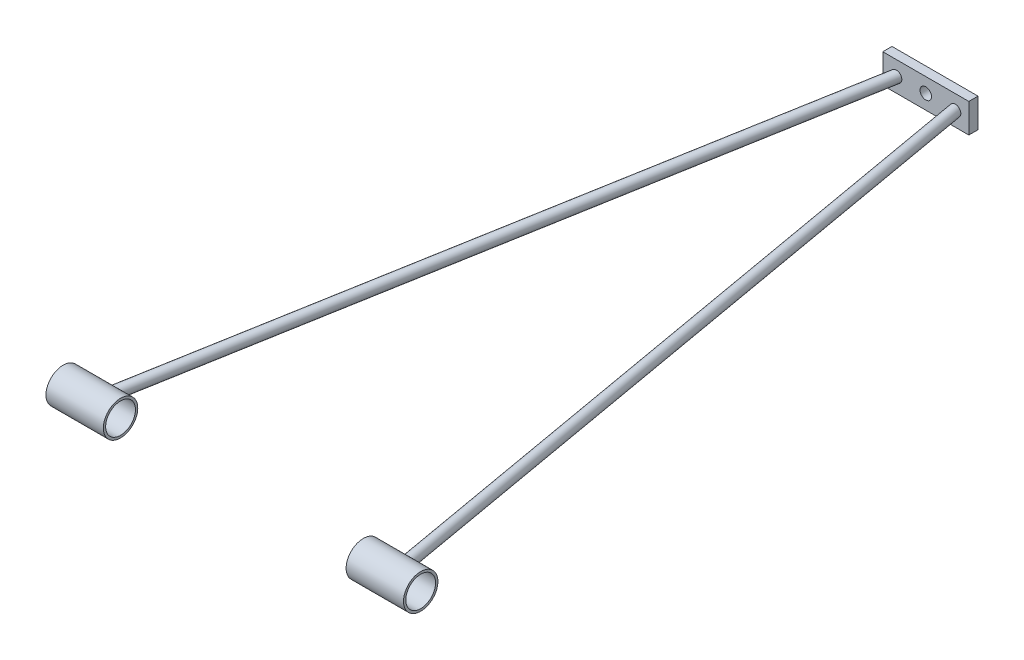
ISO-10303-21;
HEADER;
FILE_DESCRIPTION(('STEP AP214'),'2;1');
FILE_NAME('part.step','',(''),(''),'','','');
FILE_SCHEMA(('AUTOMOTIVE_DESIGN { 1 0 10303 214 1 1 1 1 }'));
ENDSEC;
DATA;
#1=APPLICATION_CONTEXT('core data for automotive mechanical design processes');
#2=APPLICATION_PROTOCOL_DEFINITION('international standard','automotive_design',2000,#1);
#3=PRODUCT_CONTEXT('',#1,'mechanical');
#4=PRODUCT('Part','Part','',(#3));
#5=PRODUCT_RELATED_PRODUCT_CATEGORY('part','',(#4));
#6=PRODUCT_DEFINITION_FORMATION('','',#4);
#7=PRODUCT_DEFINITION_CONTEXT('part definition',#1,'design');
#8=PRODUCT_DEFINITION('design','',#6,#7);
#9=PRODUCT_DEFINITION_SHAPE('','',#8);
#10=(LENGTH_UNIT() NAMED_UNIT(*) SI_UNIT(.MILLI.,.METRE.));
#11=(NAMED_UNIT(*) PLANE_ANGLE_UNIT() SI_UNIT($,.RADIAN.));
#12=(NAMED_UNIT(*) SI_UNIT($,.STERADIAN.) SOLID_ANGLE_UNIT());
#13=UNCERTAINTY_MEASURE_WITH_UNIT(LENGTH_MEASURE(1.E-05),#10,'distance_accuracy_value','');
#14=(GEOMETRIC_REPRESENTATION_CONTEXT(3) GLOBAL_UNCERTAINTY_ASSIGNED_CONTEXT((#13)) GLOBAL_UNIT_ASSIGNED_CONTEXT((#10,
#11,#12)) REPRESENTATION_CONTEXT('',''));
#15=CARTESIAN_POINT('',(0.,0.,0.));
#16=DIRECTION('',(0.,0.,1.));
#17=DIRECTION('',(1.,0.,0.));
#18=AXIS2_PLACEMENT_3D('',#15,#16,#17);
#19=CARTESIAN_POINT('',(37.5,12.7,0.));
#20=DIRECTION('',(1.,0.,0.));
#21=DIRECTION('',(0.,0.,-1.));
#22=AXIS2_PLACEMENT_3D('',#19,#20,#21);
#23=PLANE('',#22);
#24=DIRECTION('',(0.,0.,1.));
#25=VECTOR('',#24,1.);
#26=CARTESIAN_POINT('',(37.5,-12.7,0.));
#27=LINE('',#26,#25);
#28=CARTESIAN_POINT('',(37.5,-12.7,-604.));
#29=VERTEX_POINT('',#28);
#30=CARTESIAN_POINT('',(37.5,-12.7,-596.));
#31=VERTEX_POINT('',#30);
#32=EDGE_CURVE('E134',#29,#31,#27,.T.);
#33=ORIENTED_EDGE('',*,*,#32,.F.);
#34=DIRECTION('',(0.,-1.,0.));
#35=VECTOR('',#34,1.);
#36=CARTESIAN_POINT('',(37.5,12.7,-604.));
#37=LINE('',#36,#35);
#38=CARTESIAN_POINT('',(37.5,12.7,-604.));
#39=VERTEX_POINT('',#38);
#40=EDGE_CURVE('E13',#39,#29,#37,.T.);
#41=ORIENTED_EDGE('',*,*,#40,.F.);
#42=DIRECTION('',(0.,0.,1.));
#43=VECTOR('',#42,1.);
#44=CARTESIAN_POINT('',(37.5,12.7,0.));
#45=LINE('',#44,#43);
#46=CARTESIAN_POINT('',(37.5,12.7,-596.));
#47=VERTEX_POINT('',#46);
#48=EDGE_CURVE('E127',#39,#47,#45,.T.);
#49=ORIENTED_EDGE('',*,*,#48,.T.);
#50=DIRECTION('',(0.,-1.,0.));
#51=VECTOR('',#50,1.);
#52=CARTESIAN_POINT('',(37.5,12.7,-596.));
#53=LINE('',#52,#51);
#54=EDGE_CURVE('E107',#47,#31,#53,.T.);
#55=ORIENTED_EDGE('',*,*,#54,.T.);
#56=EDGE_LOOP('',(#33,#41,#49,#55));
#57=FACE_BOUND('',#56,.T.);
#58=ADVANCED_FACE('F68',(#57),#23,.T.);
#59=CARTESIAN_POINT('',(-8.94099609164793E-13,12.7,-604.));
#60=DIRECTION('',(0.,0.,-1.));
#61=DIRECTION('',(-1.,0.,0.));
#62=AXIS2_PLACEMENT_3D('',#59,#60,#61);
#63=PLANE('',#62);
#64=CARTESIAN_POINT('',(-8.94099609164793E-13,0.,-604.));
#65=DIRECTION('',(0.,0.,-1.));
#66=DIRECTION('',(-1.,0.,0.));
#67=AXIS2_PLACEMENT_3D('',#64,#65,#66);
#68=CIRCLE('',#67,5.);
#69=CARTESIAN_POINT('',(-5.00000000000089,0.,-604.));
#70=VERTEX_POINT('',#69);
#71=EDGE_CURVE('E171',#70,#70,#68,.T.);
#72=ORIENTED_EDGE('',*,*,#71,.F.);
#73=EDGE_LOOP('',(#72));
#74=FACE_BOUND('',#73,.T.);
#75=DIRECTION('',(1.,0.,0.));
#76=VECTOR('',#75,1.);
#77=CARTESIAN_POINT('',(-8.94099609164793E-13,-12.7,-604.));
#78=LINE('',#77,#76);
#79=CARTESIAN_POINT('',(-37.5,-12.7,-604.));
#80=VERTEX_POINT('',#79);
#81=EDGE_CURVE('E120',#80,#29,#78,.T.);
#82=ORIENTED_EDGE('',*,*,#81,.F.);
#83=DIRECTION('',(0.,-1.,0.));
#84=VECTOR('',#83,1.);
#85=CARTESIAN_POINT('',(-37.5,12.7,-604.));
#86=LINE('',#85,#84);
#87=CARTESIAN_POINT('',(-37.5,12.7,-604.));
#88=VERTEX_POINT('',#87);
#89=EDGE_CURVE('E77',#88,#80,#86,.T.);
#90=ORIENTED_EDGE('',*,*,#89,.F.);
#91=DIRECTION('',(1.,0.,0.));
#92=VECTOR('',#91,1.);
#93=CARTESIAN_POINT('',(-8.94099609164793E-13,12.7,-604.));
#94=LINE('',#93,#92);
#95=EDGE_CURVE('E118',#88,#39,#94,.T.);
#96=ORIENTED_EDGE('',*,*,#95,.T.);
#97=ORIENTED_EDGE('',*,*,#40,.T.);
#98=EDGE_LOOP('',(#82,#90,#96,#97));
#99=FACE_BOUND('',#98,.T.);
#100=ADVANCED_FACE('F116',(#74,#99),#63,.T.);
#101=CARTESIAN_POINT('',(-37.5,12.7,0.));
#102=DIRECTION('',(1.,0.,0.));
#103=DIRECTION('',(0.,0.,-1.));
#104=AXIS2_PLACEMENT_3D('',#101,#102,#103);
#105=PLANE('',#104);
#106=DIRECTION('',(0.,0.,1.));
#107=VECTOR('',#106,1.);
#108=CARTESIAN_POINT('',(-37.5,-12.7,0.));
#109=LINE('',#108,#107);
#110=CARTESIAN_POINT('',(-37.5,-12.7,-596.));
#111=VERTEX_POINT('',#110);
#112=EDGE_CURVE('E100',#80,#111,#109,.T.);
#113=ORIENTED_EDGE('',*,*,#112,.T.);
#114=DIRECTION('',(0.,-1.,0.));
#115=VECTOR('',#114,1.);
#116=CARTESIAN_POINT('',(-37.5,12.7,-596.));
#117=LINE('',#116,#115);
#118=CARTESIAN_POINT('',(-37.5,12.7,-596.));
#119=VERTEX_POINT('',#118);
#120=EDGE_CURVE('E121',#119,#111,#117,.T.);
#121=ORIENTED_EDGE('',*,*,#120,.F.);
#122=DIRECTION('',(0.,0.,1.));
#123=VECTOR('',#122,1.);
#124=CARTESIAN_POINT('',(-37.5,12.7,0.));
#125=LINE('',#124,#123);
#126=EDGE_CURVE('E123',#88,#119,#125,.T.);
#127=ORIENTED_EDGE('',*,*,#126,.F.);
#128=ORIENTED_EDGE('',*,*,#89,.T.);
#129=EDGE_LOOP('',(#113,#121,#127,#128));
#130=FACE_BOUND('',#129,.T.);
#131=ADVANCED_FACE('F124',(#130),#105,.F.);
#132=CARTESIAN_POINT('',(0.,12.7,-596.));
#133=DIRECTION('',(0.,0.,-1.));
#134=DIRECTION('',(-1.,0.,0.));
#135=AXIS2_PLACEMENT_3D('',#132,#133,#134);
#136=PLANE('',#135);
#137=CARTESIAN_POINT('',(-8.82257230235458E-13,0.,-596.));
#138=DIRECTION('',(0.,0.,-1.));
#139=DIRECTION('',(-1.,0.,0.));
#140=AXIS2_PLACEMENT_3D('',#137,#138,#139);
#141=CIRCLE('',#140,5.);
#142=CARTESIAN_POINT('',(-5.00000000000088,0.,-596.));
#143=VERTEX_POINT('',#142);
#144=EDGE_CURVE('E71',#143,#143,#141,.T.);
#145=ORIENTED_EDGE('',*,*,#144,.T.);
#146=EDGE_LOOP('',(#145));
#147=FACE_BOUND('',#146,.T.);
#148=DIRECTION('',(1.,0.,0.));
#149=VECTOR('',#148,1.);
#150=CARTESIAN_POINT('',(0.,-12.7,-596.));
#151=LINE('',#150,#149);
#152=EDGE_CURVE('E129',#111,#31,#151,.T.);
#153=ORIENTED_EDGE('',*,*,#152,.T.);
#154=ORIENTED_EDGE('',*,*,#54,.F.);
#155=DIRECTION('',(1.,0.,0.));
#156=VECTOR('',#155,1.);
#157=CARTESIAN_POINT('',(0.,12.7,-596.));
#158=LINE('',#157,#156);
#159=EDGE_CURVE('E85',#119,#47,#158,.T.);
#160=ORIENTED_EDGE('',*,*,#159,.F.);
#161=ORIENTED_EDGE('',*,*,#120,.T.);
#162=EDGE_LOOP('',(#153,#154,#160,#161));
#163=FACE_BOUND('',#162,.T.);
#164=ADVANCED_FACE('F143',(#147,#163),#136,.F.);
#165=CARTESIAN_POINT('',(0.,12.7,0.));
#166=DIRECTION('',(0.,1.,0.));
#167=DIRECTION('',(0.,0.,1.));
#168=AXIS2_PLACEMENT_3D('',#165,#166,#167);
#169=PLANE('',#168);
#170=ORIENTED_EDGE('',*,*,#48,.F.);
#171=ORIENTED_EDGE('',*,*,#95,.F.);
#172=ORIENTED_EDGE('',*,*,#126,.T.);
#173=ORIENTED_EDGE('',*,*,#159,.T.);
#174=EDGE_LOOP('',(#170,#171,#172,#173));
#175=FACE_BOUND('',#174,.T.);
#176=ADVANCED_FACE('F126',(#175),#169,.T.);
#177=CARTESIAN_POINT('',(0.,-12.7,0.));
#178=DIRECTION('',(0.,1.,0.));
#179=DIRECTION('',(0.,0.,1.));
#180=AXIS2_PLACEMENT_3D('',#177,#178,#179);
#181=PLANE('',#180);
#182=ORIENTED_EDGE('',*,*,#32,.T.);
#183=ORIENTED_EDGE('',*,*,#152,.F.);
#184=ORIENTED_EDGE('',*,*,#112,.F.);
#185=ORIENTED_EDGE('',*,*,#81,.T.);
#186=EDGE_LOOP('',(#182,#183,#184,#185));
#187=FACE_BOUND('',#186,.T.);
#188=ADVANCED_FACE('F145',(#187),#181,.F.);
#189=CARTESIAN_POINT('',(-8.56500056064154E-13,0.,-578.6));
#190=DIRECTION('',(0.,0.,-1.));
#191=DIRECTION('',(-1.,0.,0.));
#192=AXIS2_PLACEMENT_3D('',#189,#190,#191);
#193=CYLINDRICAL_SURFACE('',#192,5.);
#194=ORIENTED_EDGE('',*,*,#71,.T.);
#195=EDGE_LOOP('',(#194));
#196=FACE_BOUND('',#195,.T.);
#197=ORIENTED_EDGE('',*,*,#144,.F.);
#198=EDGE_LOOP('',(#197));
#199=FACE_BOUND('',#198,.T.);
#200=ADVANCED_FACE('F162',(#196,#199),#193,.F.);
#201=CLOSED_SHELL('',(#58,#100,#131,#164,#176,#188,#200));
#202=MANIFOLD_SOLID_BREP('B2',#201);
#203=CARTESIAN_POINT('',(105.79618842508,0.,0.));
#204=DIRECTION('',(1.,0.,0.));
#205=DIRECTION('',(0.,0.,-1.));
#206=AXIS2_PLACEMENT_3D('',#203,#204,#205);
#207=PLANE('',#206);
#208=CARTESIAN_POINT('',(105.79618842508,0.,0.));
#209=DIRECTION('',(1.,0.,0.));
#210=DIRECTION('',(0.,0.,-1.));
#211=AXIS2_PLACEMENT_3D('',#208,#209,#210);
#212=CIRCLE('',#211,13.);
#213=CARTESIAN_POINT('',(105.79618842508,0.,-13.));
#214=VERTEX_POINT('',#213);
#215=EDGE_CURVE('E235',#214,#214,#212,.T.);
#216=ORIENTED_EDGE('',*,*,#215,.T.);
#217=EDGE_LOOP('',(#216));
#218=FACE_BOUND('',#217,.T.);
#219=CARTESIAN_POINT('',(105.79618842508,0.,0.));
#220=DIRECTION('',(1.,0.,0.));
#221=DIRECTION('',(0.,0.,-1.));
#222=AXIS2_PLACEMENT_3D('',#219,#220,#221);
#223=CIRCLE('',#222,15.);
#224=CARTESIAN_POINT('',(105.79618842508,0.,-15.));
#225=VERTEX_POINT('',#224);
#226=EDGE_CURVE('E227',#225,#225,#223,.T.);
#227=ORIENTED_EDGE('',*,*,#226,.F.);
#228=EDGE_LOOP('',(#227));
#229=FACE_BOUND('',#228,.T.);
#230=ADVANCED_FACE('F221',(#218,#229),#207,.F.);
#231=CARTESIAN_POINT('',(155.79618842508,0.,0.));
#232=DIRECTION('',(1.,0.,0.));
#233=DIRECTION('',(0.,0.,-1.));
#234=AXIS2_PLACEMENT_3D('',#231,#232,#233);
#235=PLANE('',#234);
#236=CARTESIAN_POINT('',(155.79618842508,0.,0.));
#237=DIRECTION('',(1.,0.,0.));
#238=DIRECTION('',(0.,0.,-1.));
#239=AXIS2_PLACEMENT_3D('',#236,#237,#238);
#240=CIRCLE('',#239,13.);
#241=CARTESIAN_POINT('',(155.79618842508,0.,-13.));
#242=VERTEX_POINT('',#241);
#243=EDGE_CURVE('E231',#242,#242,#240,.T.);
#244=ORIENTED_EDGE('',*,*,#243,.F.);
#245=EDGE_LOOP('',(#244));
#246=FACE_BOUND('',#245,.T.);
#247=CARTESIAN_POINT('',(155.79618842508,0.,0.));
#248=DIRECTION('',(1.,0.,0.));
#249=DIRECTION('',(0.,0.,-1.));
#250=AXIS2_PLACEMENT_3D('',#247,#248,#249);
#251=CIRCLE('',#250,15.);
#252=CARTESIAN_POINT('',(155.79618842508,0.,-15.));
#253=VERTEX_POINT('',#252);
#254=EDGE_CURVE('E67',#253,#253,#251,.T.);
#255=ORIENTED_EDGE('',*,*,#254,.T.);
#256=EDGE_LOOP('',(#255));
#257=FACE_BOUND('',#256,.T.);
#258=ADVANCED_FACE('F251',(#246,#257),#235,.T.);
#259=CARTESIAN_POINT('',(105.79618842508,0.,0.));
#260=DIRECTION('',(1.,0.,0.));
#261=DIRECTION('',(0.,0.,-1.));
#262=AXIS2_PLACEMENT_3D('',#259,#260,#261);
#263=CYLINDRICAL_SURFACE('',#262,15.);
#264=ORIENTED_EDGE('',*,*,#254,.F.);
#265=EDGE_LOOP('',(#264));
#266=FACE_BOUND('',#265,.T.);
#267=ORIENTED_EDGE('',*,*,#226,.T.);
#268=EDGE_LOOP('',(#267));
#269=FACE_BOUND('',#268,.T.);
#270=ADVANCED_FACE('F245',(#266,#269),#263,.T.);
#271=CARTESIAN_POINT('',(105.79618842508,0.,0.));
#272=DIRECTION('',(1.,0.,0.));
#273=DIRECTION('',(0.,0.,-1.));
#274=AXIS2_PLACEMENT_3D('',#271,#272,#273);
#275=CYLINDRICAL_SURFACE('',#274,13.);
#276=ORIENTED_EDGE('',*,*,#243,.T.);
#277=EDGE_LOOP('',(#276));
#278=FACE_BOUND('',#277,.T.);
#279=ORIENTED_EDGE('',*,*,#215,.F.);
#280=EDGE_LOOP('',(#279));
#281=FACE_BOUND('',#280,.T.);
#282=ADVANCED_FACE('F243',(#278,#281),#275,.F.);
#283=CLOSED_SHELL('',(#230,#258,#270,#282));
#284=MANIFOLD_SOLID_BREP('B7',#283);
#285=CARTESIAN_POINT('',(-155.79618842508,0.,0.));
#286=DIRECTION('',(1.,0.,0.));
#287=DIRECTION('',(0.,0.,-1.));
#288=AXIS2_PLACEMENT_3D('',#285,#286,#287);
#289=PLANE('',#288);
#290=CARTESIAN_POINT('',(-155.79618842508,0.,0.));
#291=DIRECTION('',(1.,0.,0.));
#292=DIRECTION('',(0.,0.,-1.));
#293=AXIS2_PLACEMENT_3D('',#290,#291,#292);
#294=CIRCLE('',#293,13.);
#295=CARTESIAN_POINT('',(-155.79618842508,0.,-13.));
#296=VERTEX_POINT('',#295);
#297=EDGE_CURVE('E305',#296,#296,#294,.T.);
#298=ORIENTED_EDGE('',*,*,#297,.T.);
#299=EDGE_LOOP('',(#298));
#300=FACE_BOUND('',#299,.T.);
#301=CARTESIAN_POINT('',(-155.79618842508,0.,0.));
#302=DIRECTION('',(1.,0.,0.));
#303=DIRECTION('',(0.,0.,-1.));
#304=AXIS2_PLACEMENT_3D('',#301,#302,#303);
#305=CIRCLE('',#304,15.);
#306=CARTESIAN_POINT('',(-155.79618842508,0.,-15.));
#307=VERTEX_POINT('',#306);
#308=EDGE_CURVE('E297',#307,#307,#305,.T.);
#309=ORIENTED_EDGE('',*,*,#308,.F.);
#310=EDGE_LOOP('',(#309));
#311=FACE_BOUND('',#310,.T.);
#312=ADVANCED_FACE('F291',(#300,#311),#289,.F.);
#313=CARTESIAN_POINT('',(-105.79618842508,0.,0.));
#314=DIRECTION('',(1.,0.,0.));
#315=DIRECTION('',(0.,0.,-1.));
#316=AXIS2_PLACEMENT_3D('',#313,#314,#315);
#317=PLANE('',#316);
#318=CARTESIAN_POINT('',(-105.79618842508,0.,0.));
#319=DIRECTION('',(1.,0.,0.));
#320=DIRECTION('',(0.,0.,-1.));
#321=AXIS2_PLACEMENT_3D('',#318,#319,#320);
#322=CIRCLE('',#321,13.);
#323=CARTESIAN_POINT('',(-105.79618842508,0.,-13.));
#324=VERTEX_POINT('',#323);
#325=EDGE_CURVE('E301',#324,#324,#322,.T.);
#326=ORIENTED_EDGE('',*,*,#325,.F.);
#327=EDGE_LOOP('',(#326));
#328=FACE_BOUND('',#327,.T.);
#329=CARTESIAN_POINT('',(-105.79618842508,0.,0.));
#330=DIRECTION('',(1.,0.,0.));
#331=DIRECTION('',(0.,0.,-1.));
#332=AXIS2_PLACEMENT_3D('',#329,#330,#331);
#333=CIRCLE('',#332,15.);
#334=CARTESIAN_POINT('',(-105.79618842508,0.,-15.));
#335=VERTEX_POINT('',#334);
#336=EDGE_CURVE('E220',#335,#335,#333,.T.);
#337=ORIENTED_EDGE('',*,*,#336,.T.);
#338=EDGE_LOOP('',(#337));
#339=FACE_BOUND('',#338,.T.);
#340=ADVANCED_FACE('F321',(#328,#339),#317,.T.);
#341=CARTESIAN_POINT('',(-155.79618842508,0.,0.));
#342=DIRECTION('',(1.,0.,0.));
#343=DIRECTION('',(0.,0.,-1.));
#344=AXIS2_PLACEMENT_3D('',#341,#342,#343);
#345=CYLINDRICAL_SURFACE('',#344,15.);
#346=ORIENTED_EDGE('',*,*,#336,.F.);
#347=EDGE_LOOP('',(#346));
#348=FACE_BOUND('',#347,.T.);
#349=ORIENTED_EDGE('',*,*,#308,.T.);
#350=EDGE_LOOP('',(#349));
#351=FACE_BOUND('',#350,.T.);
#352=ADVANCED_FACE('F315',(#348,#351),#345,.T.);
#353=CARTESIAN_POINT('',(-155.79618842508,0.,0.));
#354=DIRECTION('',(1.,0.,0.));
#355=DIRECTION('',(0.,0.,-1.));
#356=AXIS2_PLACEMENT_3D('',#353,#354,#355);
#357=CYLINDRICAL_SURFACE('',#356,13.);
#358=ORIENTED_EDGE('',*,*,#325,.T.);
#359=EDGE_LOOP('',(#358));
#360=FACE_BOUND('',#359,.T.);
#361=ORIENTED_EDGE('',*,*,#297,.F.);
#362=EDGE_LOOP('',(#361));
#363=FACE_BOUND('',#362,.T.);
#364=ADVANCED_FACE('F313',(#360,#363),#357,.F.);
#365=CLOSED_SHELL('',(#312,#340,#352,#364));
#366=MANIFOLD_SOLID_BREP('B62',#365);
#367=CARTESIAN_POINT('',(-130.79618842508,0.,0.));
#368=DIRECTION('',(0.173648177666931,0.,-0.984807753012208));
#369=DIRECTION('',(-0.984807753012208,0.,-0.173648177666931));
#370=AXIS2_PLACEMENT_3D('',#367,#368,#369);
#371=CYLINDRICAL_SURFACE('',#370,4.76249999999999);
#372=CARTESIAN_POINT('',(-132.987252953558,0.,-15.));
#373=CARTESIAN_POINT('',(-132.987250690457,-0.266614245133891,-14.9999978915854));
#374=CARTESIAN_POINT('',(-132.965721917555,-0.533255807218255,-14.9928266818526));
#375=CARTESIAN_POINT('',(-132.880155555307,-1.05892786282802,-14.9648927104725));
#376=CARTESIAN_POINT('',(-132.816108903789,-1.31795672150427,-14.9441270513455));
#377=CARTESIAN_POINT('',(-132.647164017872,-1.82093602765489,-14.8912102567608));
#378=CARTESIAN_POINT('',(-132.542286767594,-2.06489414595234,-14.8590649704178));
#379=CARTESIAN_POINT('',(-132.294192858116,-2.53118099196143,-14.7867794827132));
#380=CARTESIAN_POINT('',(-132.150973765205,-2.75350834546011,-14.7466387738917));
#381=CARTESIAN_POINT('',(-131.828429207822,-3.17186796406202,-14.6623720645925));
#382=CARTESIAN_POINT('',(-131.648864862487,-3.3677111593255,-14.6182208222531));
#383=CARTESIAN_POINT('',(-131.258558677516,-3.72572066634398,-14.5311054985029));
#384=CARTESIAN_POINT('',(-131.047819693159,-3.88789005901005,-14.4881413087973));
#385=CARTESIAN_POINT('',(-130.602933756427,-4.17225985564002,-14.4088132685777));
#386=CARTESIAN_POINT('',(-130.369053961526,-4.29485960924503,-14.372385232503));
#387=CARTESIAN_POINT('',(-129.882679173413,-4.49874503458203,-14.309883110761));
#388=CARTESIAN_POINT('',(-129.630189440739,-4.5800423305306,-14.2838061123366));
#389=CARTESIAN_POINT('',(-129.121982203394,-4.69750779395733,-14.2456009200969));
#390=CARTESIAN_POINT('',(-128.866589374779,-4.73495798589214,-14.2330773258797));
#391=CARTESIAN_POINT('',(-128.352830120745,-4.7688780732392,-14.2217482782494));
#392=CARTESIAN_POINT('',(-128.094463546421,-4.76534590751579,-14.2229435148006));
#393=CARTESIAN_POINT('',(-127.580111976594,-4.71839459907681,-14.2385860567525));
#394=CARTESIAN_POINT('',(-127.324154606141,-4.67470789250263,-14.2531222567231));
#395=CARTESIAN_POINT('',(-126.822678969356,-4.54935799375968,-14.2936220151963));
#396=CARTESIAN_POINT('',(-126.57716393167,-4.46768314794056,-14.3195890802231));
#397=CARTESIAN_POINT('',(-126.086679655308,-4.26261471864122,-14.3820125900355));
#398=CARTESIAN_POINT('',(-125.842763634156,-4.13687334947464,-14.4190368180883));
#399=CARTESIAN_POINT('',(-125.3786209083,-3.84870267111911,-14.4986148088968));
#400=CARTESIAN_POINT('',(-125.15840496834,-3.68625679344039,-14.5411710651257));
#401=CARTESIAN_POINT('',(-124.735943409489,-3.31808683374763,-14.6296920050369));
#402=CARTESIAN_POINT('',(-124.535315722867,-3.11049610673663,-14.6757164959765));
#403=CARTESIAN_POINT('',(-124.263971652547,-2.77490380763042,-14.7415390481084));
#404=CARTESIAN_POINT('',(-124.178418612791,-2.65893664579798,-14.7629548223614));
#405=CARTESIAN_POINT('',(-124.017997405546,-2.41957217355184,-14.8040664716835));
#406=CARTESIAN_POINT('',(-123.943123777752,-2.29617870637639,-14.8237632236618));
#407=CARTESIAN_POINT('',(-123.807501961027,-2.04750614078382,-14.8601115999152));
#408=CARTESIAN_POINT('',(-123.746329847818,-1.922470636661,-14.8768496278749));
#409=CARTESIAN_POINT('',(-123.635430040673,-1.66716212629692,-14.9076184157149));
#410=CARTESIAN_POINT('',(-123.585696649266,-1.53689176561649,-14.9216505228126));
#411=CARTESIAN_POINT('',(-123.498330854373,-1.27212498822494,-14.9465503765266));
#412=CARTESIAN_POINT('',(-123.460692531067,-1.13763067438139,-14.9574196709054));
#413=CARTESIAN_POINT('',(-123.398041257566,-0.86550053161229,-14.9756300463175));
#414=CARTESIAN_POINT('',(-123.373026970347,-0.727865036986662,-14.9829715009835));
#415=CARTESIAN_POINT('',(-123.337855959722,-0.464520447035637,-14.993325897273));
#416=CARTESIAN_POINT('',(-123.326467774319,-0.338988525974453,-14.996697070708));
#417=CARTESIAN_POINT('',(-123.314387413298,-0.0873197519646819,-15.0002737972195));
#418=CARTESIAN_POINT('',(-123.313698730715,0.038817285091385,-15.0004783164875));
#419=CARTESIAN_POINT('',(-123.323034455909,0.290582505031833,-14.9977132253898));
#420=CARTESIAN_POINT('',(-123.333052524292,0.416210944867035,-14.9947454932925));
#421=CARTESIAN_POINT('',(-123.363662806429,0.666105498254987,-14.9857246684807));
#422=CARTESIAN_POINT('',(-123.384258962428,0.790371086252886,-14.9796704254909));
#423=CARTESIAN_POINT('',(-123.434583600704,1.03091843795602,-14.9649941538429));
#424=CARTESIAN_POINT('',(-123.463850037481,1.14730501660522,-14.9565025942056));
#425=CARTESIAN_POINT('',(-123.531441549307,1.37722350807631,-14.9370879520683));
#426=CARTESIAN_POINT('',(-123.56976975498,1.49075441930345,-14.9261640293217));
#427=CARTESIAN_POINT('',(-123.697765360141,1.82596019997144,-14.8901376968485));
#428=CARTESIAN_POINT('',(-123.800485213646,2.0424430656299,-14.8617681597571));
#429=CARTESIAN_POINT('',(-124.043219665748,2.46766638232546,-14.7972785737692));
#430=CARTESIAN_POINT('',(-124.184933100027,2.67537583051959,-14.7608255076588));
#431=CARTESIAN_POINT('',(-124.498225235328,3.06625718135078,-14.6846096290413));
#432=CARTESIAN_POINT('',(-124.669817160568,3.24941815504206,-14.6448453550775));
#433=CARTESIAN_POINT('',(-125.056232719782,3.60449581407703,-14.5617318727647));
#434=CARTESIAN_POINT('',(-125.273631807745,3.77361484859444,-14.5184076224221));
#435=CARTESIAN_POINT('',(-125.733579595275,4.07526498562972,-14.4366452256465));
#436=CARTESIAN_POINT('',(-125.976138598236,4.2077810166036,-14.3982090954357));
#437=CARTESIAN_POINT('',(-126.360198793372,4.37912348533151,-14.3466731173985));
#438=CARTESIAN_POINT('',(-126.494921791627,4.43254027716654,-14.3302152936633));
#439=CARTESIAN_POINT('',(-126.768690901755,4.52787117471529,-14.3003806939594));
#440=CARTESIAN_POINT('',(-126.907735257028,4.56978988795558,-14.2870026841897));
#441=CARTESIAN_POINT('',(-127.189190196785,4.64166538907823,-14.2638132721772));
#442=CARTESIAN_POINT('',(-127.331601205741,4.67162065998502,-14.254002322255));
#443=CARTESIAN_POINT('',(-127.618632598057,4.71912462907966,-14.2383458245341));
#444=CARTESIAN_POINT('',(-127.763251848031,4.73667948672577,-14.232498308101));
#445=CARTESIAN_POINT('',(-128.046912410506,4.75853254202185,-14.2252062545397));
#446=CARTESIAN_POINT('',(-128.185904842545,4.76340257201522,-14.2235718285829));
#447=CARTESIAN_POINT('',(-128.463736377763,4.76132324452508,-14.2242681267466));
#448=CARTESIAN_POINT('',(-128.602575521812,4.75437921222917,-14.2265970643814));
#449=CARTESIAN_POINT('',(-128.879000786009,4.72857427365842,-14.235194748235));
#450=CARTESIAN_POINT('',(-129.016587087803,4.70971512375842,-14.2414629137824));
#451=CARTESIAN_POINT('',(-129.289368939385,4.66010289939011,-14.2577740973448));
#452=CARTESIAN_POINT('',(-129.424564605231,4.62935040397444,-14.2678169315815));
#453=CARTESIAN_POINT('',(-129.682515540703,4.55856019165586,-14.2905847434322));
#454=CARTESIAN_POINT('',(-129.805498937444,4.51927903595132,-14.3030860157047));
#455=CARTESIAN_POINT('',(-130.047550244672,4.43072121362804,-14.3307662493205));
#456=CARTESIAN_POINT('',(-130.166616833941,4.38144121357478,-14.3459461034341));
#457=CARTESIAN_POINT('',(-130.399911511165,4.27324486348117,-14.3785453439435));
#458=CARTESIAN_POINT('',(-130.514141391603,4.21433212338893,-14.3959638908496));
#459=CARTESIAN_POINT('',(-130.737086134593,4.08724722049853,-14.4325598382569));
#460=CARTESIAN_POINT('',(-130.84579890301,4.01907157734683,-14.4517378989772));
#461=CARTESIAN_POINT('',(-131.056358559691,3.87437288011393,-14.4911979383344));
#462=CARTESIAN_POINT('',(-131.158241801886,3.79790084274911,-14.5114728243377));
#463=CARTESIAN_POINT('',(-131.355231901884,3.63681683969218,-14.5526798898773));
#464=CARTESIAN_POINT('',(-131.450336294674,3.55220193900609,-14.5736123045668));
#465=CARTESIAN_POINT('',(-131.724577166157,3.28700452073364,-14.6365467199797));
#466=CARTESIAN_POINT('',(-131.892822004784,3.09494468153789,-14.6787212698619));
#467=CARTESIAN_POINT('',(-132.200650147769,2.67939890811184,-14.7603173344739));
#468=CARTESIAN_POINT('',(-132.339216158068,2.45513995621747,-14.7996174788564));
#469=CARTESIAN_POINT('',(-132.577970730227,1.98583615705772,-14.8698572587802));
#470=CARTESIAN_POINT('',(-132.678164944343,1.74079437765245,-14.9007981254649));
#471=CARTESIAN_POINT('',(-132.833816213676,1.24914274930597,-14.9498372338243));
#472=CARTESIAN_POINT('',(-132.891239959826,1.0032092305357,-14.9684947272397));
#473=CARTESIAN_POINT('',(-132.96795852809,0.504858439497234,-14.9935768283864));
#474=CARTESIAN_POINT('',(-132.987255096357,0.252441464695411,-15.0000019963347));
#475=CARTESIAN_POINT('',(-132.987252953558,0.,-15.));
#476=B_SPLINE_CURVE_WITH_KNOTS('',3,(#372,#373,#374,#375,#376,#377,#378,#379,#380,#381,#382,
#383,#384,#385,#386,#387,#388,#389,#390,#391,#392,#393,#394,#395,#396,#397,#398,#399,#400,#401,
#402,#403,#404,#405,#406,#407,#408,#409,#410,#411,#412,#413,#414,#415,#416,#417,#418,#419,#420,
#421,#422,#423,#424,#425,#426,#427,#428,#429,#430,#431,#432,#433,#434,#435,#436,#437,#438,#439,
#440,#441,#442,#443,#444,#445,#446,#447,#448,#449,#450,#451,#452,#453,#454,#455,#456,#457,#458,
#459,#460,#461,#462,#463,#464,#465,#466,#467,#468,#469,#470,#471,#472,#473,#474,#475),
.UNSPECIFIED.,.T.,.F.,(4,2,2,2,2,2,2,2,2,2,2,2,2,2,2,2,2,2,2,2,2,2,2,2,2,2,2,2,2,2,2,2,2,2,2,2,
2,2,2,2,2,2,2,2,2,2,2,2,2,2,2,4),(0.,0.798936909361909,1.59804415717563,2.39674125977651,
3.19548907090228,3.99966789914665,4.80377311835374,5.59948899982248,6.39498080976117,
7.1665818125246,7.93822162177244,8.71504070834072,9.49209825762694,10.3191941779113,
11.1466641995163,12.0189242542284,12.4555228016271,12.8918973130679,13.3119328244191,
13.7317586665104,14.1513787146537,14.5709543111135,14.9487489147975,15.3266668533966,
15.7043611532469,16.082196314547,16.4427066832842,16.8033417821039,17.5240198406525,
18.2831878053734,19.0426926358013,19.8756026792274,20.7088551696976,21.1459698384068,
21.5829090891488,22.0199037266152,22.4566811498239,22.8733978713242,23.2899268075581,
23.7063943587234,24.1228416358385,24.5114987392175,24.9002856273998,25.288927147062,
25.6777150970392,26.0642349633583,26.4508946715151,27.2235551543964,28.0195155410047,
28.8153586356232,29.5718600030456,30.3283267233337),.UNSPECIFIED.);
#477=CARTESIAN_POINT('',(-132.987252953558,0.,-15.));
#478=VERTEX_POINT('',#477);
#479=EDGE_CURVE('E364',#478,#478,#476,.T.);
#480=ORIENTED_EDGE('',*,*,#479,.F.);
#481=EDGE_LOOP('',(#480));
#482=FACE_BOUND('',#481,.T.);
#483=CARTESIAN_POINT('',(-25.7053079228338,0.,-596.));
#484=DIRECTION('',(0.,0.,1.));
#485=DIRECTION('',(1.,0.,0.));
#486=AXIS2_PLACEMENT_3D('',#483,#484,#485);
#487=ELLIPSE('',#486,4.83596923910586,4.76249999999999);
#488=CARTESIAN_POINT('',(-20.869338683728,0.,-596.));
#489=VERTEX_POINT('',#488);
#490=EDGE_CURVE('E290',#489,#489,#487,.F.);
#491=ORIENTED_EDGE('',*,*,#490,.F.);
#492=EDGE_LOOP('',(#491));
#493=FACE_BOUND('',#492,.T.);
#494=ADVANCED_FACE('F360',(#482,#493),#371,.T.);
#495=CARTESIAN_POINT('',(155.79618842508,-12.7,-596.));
#496=DIRECTION('',(0.,0.,1.));
#497=DIRECTION('',(1.,0.,0.));
#498=AXIS2_PLACEMENT_3D('',#495,#496,#497);
#499=PLANE('',#498);
#500=ORIENTED_EDGE('',*,*,#490,.T.);
#501=EDGE_LOOP('',(#500));
#502=FACE_BOUND('',#501,.T.);
#503=ADVANCED_FACE('F381',(#502),#499,.F.);
#504=CARTESIAN_POINT('',(155.79618842508,0.,0.));
#505=DIRECTION('',(-1.,0.,0.));
#506=DIRECTION('',(0.,0.,1.));
#507=AXIS2_PLACEMENT_3D('',#504,#505,#506);
#508=CYLINDRICAL_SURFACE('',#507,15.);
#509=ORIENTED_EDGE('',*,*,#479,.T.);
#510=EDGE_LOOP('',(#509));
#511=FACE_BOUND('',#510,.T.);
#512=ADVANCED_FACE('F377',(#511),#508,.F.);
#513=CLOSED_SHELL('',(#494,#503,#512));
#514=MANIFOLD_SOLID_BREP('B215',#513);
#515=CARTESIAN_POINT('',(130.79618842508,0.,0.));
#516=DIRECTION('',(-0.173648177666931,0.,-0.984807753012208));
#517=DIRECTION('',(-0.984807753012208,0.,0.173648177666931));
#518=AXIS2_PLACEMENT_3D('',#515,#516,#517);
#519=CYLINDRICAL_SURFACE('',#518,4.76249999999999);
#520=CARTESIAN_POINT('',(123.315314475347,0.,-15.0000000000001));
#521=CARTESIAN_POINT('',(123.315314641439,-0.124945761985219,-14.9999999118857));
#522=CARTESIAN_POINT('',(123.320588612776,-0.249893847926332,-14.9984349966013));
#523=CARTESIAN_POINT('',(123.341619292743,-0.49887534884068,-14.9922192925973));
#524=CARTESIAN_POINT('',(123.357380284579,-0.622908369137209,-14.9875672430035));
#525=CARTESIAN_POINT('',(123.399183055103,-0.869062750947202,-14.975310158799));
#526=CARTESIAN_POINT('',(123.425223598431,-0.991184340336918,-14.9677054790267));
#527=CARTESIAN_POINT('',(123.487275094538,-1.23270668882601,-14.9497527802646));
#528=CARTESIAN_POINT('',(123.523290061617,-1.35210633146838,-14.9394036568193));
#529=CARTESIAN_POINT('',(123.60473279262,-1.58694022143662,-14.9162826618409));
#530=CARTESIAN_POINT('',(123.650127390923,-1.7023868135801,-14.9035193398153));
#531=CARTESIAN_POINT('',(123.749924463595,-1.92907270317518,-14.8758779307442));
#532=CARTESIAN_POINT('',(123.804330320211,-2.04031040154778,-14.8609990499521));
#533=CARTESIAN_POINT('',(123.980279555934,-2.36670866055737,-14.8137397194351));
#534=CARTESIAN_POINT('',(124.114620540739,-2.57474207664902,-14.7787171861434));
#535=CARTESIAN_POINT('',(124.421205628188,-2.97838599769792,-14.702851765702));
#536=CARTESIAN_POINT('',(124.595146740294,-3.17265508859661,-14.6617931249243));
#537=CARTESIAN_POINT('',(124.971102648668,-3.53185279899656,-14.5794375948738));
#538=CARTESIAN_POINT('',(125.173129768394,-3.69676846609839,-14.5381406086865));
#539=CARTESIAN_POINT('',(125.61931959281,-4.00736382364998,-14.4557645899734));
#540=CARTESIAN_POINT('',(125.865627969749,-4.1500570230108,-14.4150271208926));
#541=CARTESIAN_POINT('',(126.379723437683,-4.39340080661851,-14.342742757147));
#542=CARTESIAN_POINT('',(126.647513484364,-4.49404559350898,-14.3111971299737));
#543=CARTESIAN_POINT('',(127.060498065857,-4.6108798353369,-14.2738011160486));
#544=CARTESIAN_POINT('',(127.200599610898,-4.6441967841032,-14.2629673914549));
#545=CARTESIAN_POINT('',(127.483347684999,-4.6988018941766,-14.2450731529635));
#546=CARTESIAN_POINT('',(127.625993096705,-4.72009520866903,-14.2380110226763));
#547=CARTESIAN_POINT('',(127.912691682664,-4.75027766471886,-14.227969333548));
#548=CARTESIAN_POINT('',(128.05674447393,-4.75917009114998,-14.2249886935639));
#549=CARTESIAN_POINT('',(128.345101679486,-4.76428249516633,-14.2232775249353));
#550=CARTESIAN_POINT('',(128.489406073591,-4.76050344641572,-14.2245466697415));
#551=CARTESIAN_POINT('',(128.767061814145,-4.74082076083544,-14.2311177861225));
#552=CARTESIAN_POINT('',(128.900481133463,-4.72577277558032,-14.2361350965582));
#553=CARTESIAN_POINT('',(129.165453713421,-4.68453878221758,-14.2497567867944));
#554=CARTESIAN_POINT('',(129.297006324668,-4.65834899171076,-14.2583623847202));
#555=CARTESIAN_POINT('',(129.557084754753,-4.59495423383339,-14.27891813426));
#556=CARTESIAN_POINT('',(129.685612205557,-4.55775535965339,-14.2908664355904));
#557=CARTESIAN_POINT('',(129.938762720111,-4.47254610238741,-14.3177626037243));
#558=CARTESIAN_POINT('',(130.063384330514,-4.42453174805981,-14.3327115720964));
#559=CARTESIAN_POINT('',(130.302228973313,-4.3204347975722,-14.3644235939655));
#560=CARTESIAN_POINT('',(130.416667622605,-4.26481189599855,-14.38107489634));
#561=CARTESIAN_POINT('',(130.640355932297,-4.14437838358227,-14.4162430142481));
#562=CARTESIAN_POINT('',(130.74960374728,-4.07956453737424,-14.4347604860375));
#563=CARTESIAN_POINT('',(130.962140339615,-3.94123180792756,-14.4731419983771));
#564=CARTESIAN_POINT('',(131.065430925999,-3.8677155882604,-14.4930056261121));
#565=CARTESIAN_POINT('',(131.265502351617,-3.71243849602739,-14.5335557282918));
#566=CARTESIAN_POINT('',(131.362280718138,-3.63067452088214,-14.5542425105994));
#567=CARTESIAN_POINT('',(131.550337509073,-3.45798901514956,-14.5962437839242));
#568=CARTESIAN_POINT('',(131.641492592184,-3.36693408364122,-14.6175629504917));
#569=CARTESIAN_POINT('',(131.815936041681,-3.17749667974192,-14.6599100621093));
#570=CARTESIAN_POINT('',(131.899221500941,-3.07911152330279,-14.6809378971094));
#571=CARTESIAN_POINT('',(132.136486020824,-2.77396912171071,-14.7427265005026));
#572=CARTESIAN_POINT('',(132.278046256569,-2.55706547959578,-14.782232648535));
#573=CARTESIAN_POINT('',(132.527640907975,-2.09641405918003,-14.854655909842));
#574=CARTESIAN_POINT('',(132.63471274742,-1.85211678734559,-14.887376014477));
#575=CARTESIAN_POINT('',(132.807721814507,-1.34814002362662,-14.941441534246));
#576=CARTESIAN_POINT('',(132.873660132121,-1.08846093953492,-14.9627872507807));
#577=CARTESIAN_POINT('',(132.962628575343,-0.56154334638986,-14.9918031501941));
#578=CARTESIAN_POINT('',(132.985728349137,-0.294317826110858,-14.9994955302));
#579=CARTESIAN_POINT('',(132.988631071386,0.24038724353001,-15.0004559946466));
#580=CARTESIAN_POINT('',(132.968435911046,0.507866781285763,-14.9937247091401));
#581=CARTESIAN_POINT('',(132.885629051588,1.03317765625295,-14.9666689163987));
#582=CARTESIAN_POINT('',(132.823369312744,1.29107046523804,-14.9464572195359));
#583=CARTESIAN_POINT('',(132.658348907474,1.79235326298573,-14.894663706537));
#584=CARTESIAN_POINT('',(132.555585161512,2.03574214738897,-14.8630810258762));
#585=CARTESIAN_POINT('',(132.31111660359,2.50306370588799,-14.7915854711184));
#586=CARTESIAN_POINT('',(132.169134879854,2.72684253511993,-14.7516138651665));
#587=CARTESIAN_POINT('',(131.849867456143,3.14681853679362,-14.6677692967945));
#588=CARTESIAN_POINT('',(131.672579526853,3.34301396622062,-14.6238960881151));
#589=CARTESIAN_POINT('',(131.286134527621,3.70301045063641,-14.5369259347799));
#590=CARTESIAN_POINT('',(131.076854378227,3.86668052850544,-14.4938327395159));
#591=CARTESIAN_POINT('',(130.632350370971,4.15576797210822,-14.4136112845885));
#592=CARTESIAN_POINT('',(130.397132868989,4.28119468103857,-14.3764815690444));
#593=CARTESIAN_POINT('',(129.913394464304,4.48752578969159,-14.313404186444));
#594=CARTESIAN_POINT('',(129.665337099027,4.56944014701702,-14.28720620087));
#595=CARTESIAN_POINT('',(129.158167973994,4.69126421342408,-14.2476734156771));
#596=CARTESIAN_POINT('',(128.899057934049,4.73118043284857,-14.2343366224067));
#597=CARTESIAN_POINT('',(128.382751515887,4.76833630450994,-14.2219312733083));
#598=CARTESIAN_POINT('',(128.125620729163,4.76641459362297,-14.2225823290266));
#599=CARTESIAN_POINT('',(127.615101569448,4.72315406953312,-14.2370045719273));
#600=CARTESIAN_POINT('',(127.361713942498,4.68180750345381,-14.2507783396834));
#601=CARTESIAN_POINT('',(126.855546213119,4.5596029329996,-14.2903557735814));
#602=CARTESIAN_POINT('',(126.603145786558,4.47732034039597,-14.3165915095534));
#603=CARTESIAN_POINT('',(126.114850718188,4.2755249447709,-14.3781414456192));
#604=CARTESIAN_POINT('',(125.878962649711,4.15599741713885,-14.4134592352939));
#605=CARTESIAN_POINT('',(125.412735288702,3.87286743974123,-14.4922051341812));
#606=CARTESIAN_POINT('',(125.184009921268,3.70671697002331,-14.5360334512817));
#607=CARTESIAN_POINT('',(124.757419737264,3.33850428903181,-14.6249826035618));
#608=CARTESIAN_POINT('',(124.559565866342,3.13642939465139,-14.6701038904893));
#609=CARTESIAN_POINT('',(124.289502605496,2.80813011577877,-14.7352360184081));
#610=CARTESIAN_POINT('',(124.203331332469,2.69343442602033,-14.7566896061872));
#611=CARTESIAN_POINT('',(124.041493006865,2.45660072231459,-14.7979570334668));
#612=CARTESIAN_POINT('',(123.965821244808,2.33446608066012,-14.817771606514));
#613=CARTESIAN_POINT('',(123.825870071344,2.08361014996242,-14.8551217902338));
#614=CARTESIAN_POINT('',(123.761583307529,1.95489318151002,-14.8726588697407));
#615=CARTESIAN_POINT('',(123.645164129813,1.69173740808482,-14.9048844364043));
#616=CARTESIAN_POINT('',(123.593029392325,1.55729970279677,-14.9195734680453));
#617=CARTESIAN_POINT('',(123.509263779403,1.30658569694867,-14.9434250305842));
#618=CARTESIAN_POINT('',(123.475664344327,1.19101208981276,-14.9531005025304));
#619=CARTESIAN_POINT('',(123.417771839913,0.957333495373542,-14.9698774783566));
#620=CARTESIAN_POINT('',(123.393481022905,0.839227902717042,-14.9769783592618));
#621=CARTESIAN_POINT('',(123.354515018903,0.601390199232193,-14.9884120018642));
#622=CARTESIAN_POINT('',(123.339833239557,0.481659261168046,-14.9927466612972));
#623=CARTESIAN_POINT('',(123.320231093635,0.24128648328167,-14.9985412312289));
#624=CARTESIAN_POINT('',(123.315314314972,0.120644324990421,-15.000000085081));
#625=CARTESIAN_POINT('',(123.315314475347,0.,-15.0000000000001));
#626=B_SPLINE_CURVE_WITH_KNOTS('',3,(#520,#521,#522,#523,#524,#525,#526,#527,#528,#529,#530,
#531,#532,#533,#534,#535,#536,#537,#538,#539,#540,#541,#542,#543,#544,#545,#546,#547,#548,#549,
#550,#551,#552,#553,#554,#555,#556,#557,#558,#559,#560,#561,#562,#563,#564,#565,#566,#567,#568,
#569,#570,#571,#572,#573,#574,#575,#576,#577,#578,#579,#580,#581,#582,#583,#584,#585,#586,#587,
#588,#589,#590,#591,#592,#593,#594,#595,#596,#597,#598,#599,#600,#601,#602,#603,#604,#605,#606,
#607,#608,#609,#610,#611,#612,#613,#614,#615,#616,#617,#618,#619,#620,#621,#622,#623,#624,#625),
.UNSPECIFIED.,.T.,.F.,(4,2,2,2,2,2,2,2,2,2,2,2,2,2,2,2,2,2,2,2,2,2,2,2,2,2,2,2,2,2,2,2,2,2,2,2,
2,2,2,2,2,2,2,2,2,2,2,2,2,2,2,2,4),(0.,0.374721034797919,0.749595210672271,1.12442434920056,
1.49940456098998,1.87308089200425,2.24689779622607,2.99393889851848,3.78267483856299,
4.57175795555928,5.43055178041896,6.28946397103624,6.72223729787794,7.15482500220909,
7.587298096516,8.01973796076081,8.42230312729404,8.82500506508657,9.22748453519157,
9.63011202981105,10.0146409636361,10.3993055956194,10.7838527946588,11.1685451931108,
11.5598591533607,11.9513171087486,12.7335254311387,13.5359794985723,14.3384123013669,
15.139539337288,15.9406313791958,16.7351022446285,17.5296335256556,18.3299249583575,
19.130266939339,19.9337692856105,20.7370751715015,21.5208162157966,22.3044357505378,
23.0723624447565,23.8404401824946,24.6373430470599,25.4345613640217,26.2890091034059,
27.1437591065466,27.5784445015609,28.0129342869332,28.4471424482973,28.881267516527,
29.2431164453881,29.6050528726428,29.9667407296901,30.3285614556164),.UNSPECIFIED.);
#627=CARTESIAN_POINT('',(123.315314475347,0.,-15.0000000000001));
#628=VERTEX_POINT('',#627);
#629=EDGE_CURVE('E410',#628,#628,#626,.T.);
#630=ORIENTED_EDGE('',*,*,#629,.F.);
#631=EDGE_LOOP('',(#630));
#632=FACE_BOUND('',#631,.T.);
#633=CARTESIAN_POINT('',(25.7053079228338,0.,-596.));
#634=DIRECTION('',(0.,0.,1.));
#635=DIRECTION('',(-1.,0.,0.));
#636=AXIS2_PLACEMENT_3D('',#633,#634,#635);
#637=ELLIPSE('',#636,4.83596923910586,4.76249999999999);
#638=CARTESIAN_POINT('',(20.869338683728,0.,-596.));
#639=VERTEX_POINT('',#638);
#640=EDGE_CURVE('E359',#639,#639,#637,.F.);
#641=ORIENTED_EDGE('',*,*,#640,.F.);
#642=EDGE_LOOP('',(#641));
#643=FACE_BOUND('',#642,.T.);
#644=ADVANCED_FACE('F406',(#632,#643),#519,.T.);
#645=CARTESIAN_POINT('',(155.79618842508,-12.7,-596.));
#646=DIRECTION('',(0.,0.,1.));
#647=DIRECTION('',(1.,0.,0.));
#648=AXIS2_PLACEMENT_3D('',#645,#646,#647);
#649=PLANE('',#648);
#650=ORIENTED_EDGE('',*,*,#640,.T.);
#651=EDGE_LOOP('',(#650));
#652=FACE_BOUND('',#651,.T.);
#653=ADVANCED_FACE('F427',(#652),#649,.F.);
#654=CARTESIAN_POINT('',(155.79618842508,0.,0.));
#655=DIRECTION('',(-1.,0.,0.));
#656=DIRECTION('',(0.,0.,1.));
#657=AXIS2_PLACEMENT_3D('',#654,#655,#656);
#658=CYLINDRICAL_SURFACE('',#657,15.);
#659=ORIENTED_EDGE('',*,*,#629,.T.);
#660=EDGE_LOOP('',(#659));
#661=FACE_BOUND('',#660,.T.);
#662=ADVANCED_FACE('F423',(#661),#658,.F.);
#663=CLOSED_SHELL('',(#644,#653,#662));
#664=MANIFOLD_SOLID_BREP('B285',#663);
#665=ADVANCED_BREP_SHAPE_REPRESENTATION('',(#18,#202,#284,#366,#514,#664),#14);
#666=SHAPE_DEFINITION_REPRESENTATION(#9,#665);
ENDSEC;
END-ISO-10303-21;
